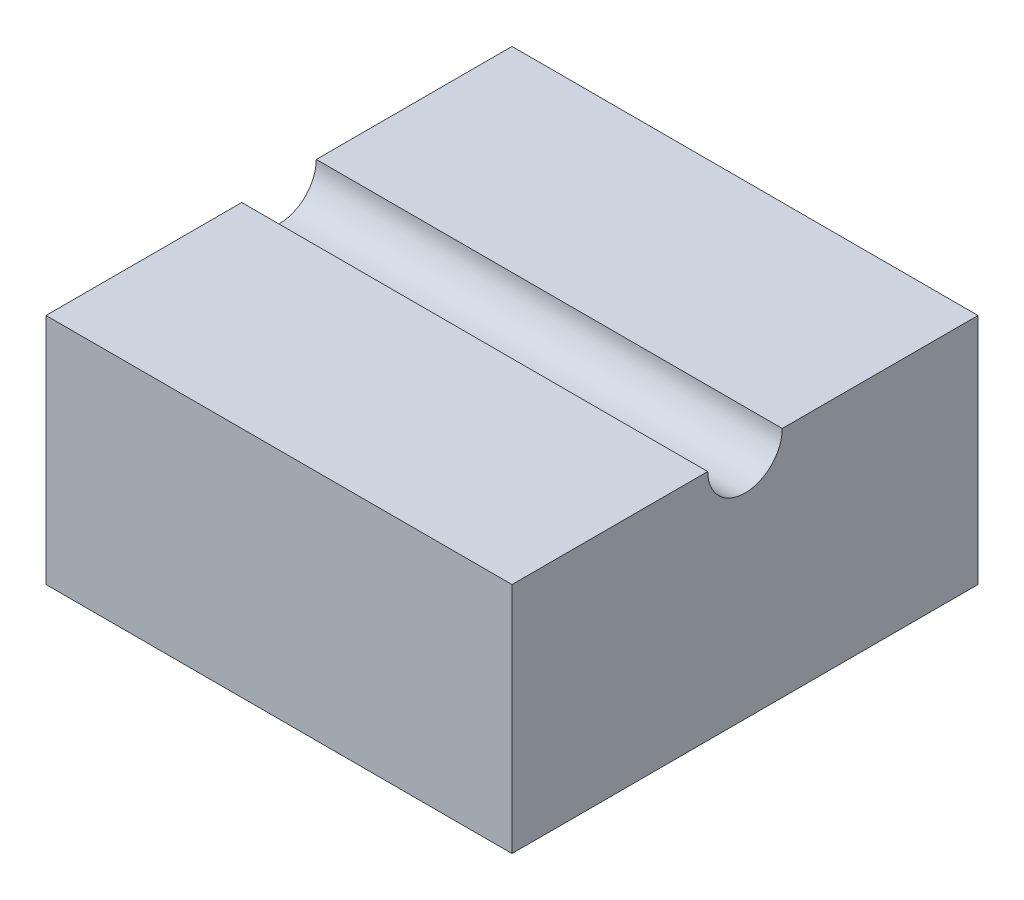
ISO-10303-21;
HEADER;
FILE_DESCRIPTION(('STEP AP214'),'2;1');
FILE_NAME('part.step','',(''),(''),'','','');
FILE_SCHEMA(('AUTOMOTIVE_DESIGN { 1 0 10303 214 1 1 1 1 }'));
ENDSEC;
DATA;
#1=APPLICATION_CONTEXT('core data for automotive mechanical design processes');
#2=APPLICATION_PROTOCOL_DEFINITION('international standard','automotive_design',2000,#1);
#3=PRODUCT_CONTEXT('',#1,'mechanical');
#4=PRODUCT('Part','Part','',(#3));
#5=PRODUCT_RELATED_PRODUCT_CATEGORY('part','',(#4));
#6=PRODUCT_DEFINITION_FORMATION('','',#4);
#7=PRODUCT_DEFINITION_CONTEXT('part definition',#1,'design');
#8=PRODUCT_DEFINITION('design','',#6,#7);
#9=PRODUCT_DEFINITION_SHAPE('','',#8);
#10=(LENGTH_UNIT() NAMED_UNIT(*) SI_UNIT(.MILLI.,.METRE.));
#11=(NAMED_UNIT(*) PLANE_ANGLE_UNIT() SI_UNIT($,.RADIAN.));
#12=(NAMED_UNIT(*) SI_UNIT($,.STERADIAN.) SOLID_ANGLE_UNIT());
#13=UNCERTAINTY_MEASURE_WITH_UNIT(LENGTH_MEASURE(1.E-05),#10,'distance_accuracy_value','');
#14=(GEOMETRIC_REPRESENTATION_CONTEXT(3) GLOBAL_UNCERTAINTY_ASSIGNED_CONTEXT((#13)) GLOBAL_UNIT_ASSIGNED_CONTEXT((#10,
#11,#12)) REPRESENTATION_CONTEXT('',''));
#15=CARTESIAN_POINT('',(0.,0.,0.));
#16=DIRECTION('',(0.,0.,1.));
#17=DIRECTION('',(1.,0.,0.));
#18=AXIS2_PLACEMENT_3D('',#15,#16,#17);
#19=CARTESIAN_POINT('',(0.,50.,0.));
#20=DIRECTION('',(0.,1.,0.));
#21=DIRECTION('',(0.,0.,1.));
#22=AXIS2_PLACEMENT_3D('',#19,#20,#21);
#23=PLANE('',#22);
#24=DIRECTION('',(1.,0.,0.));
#25=VECTOR('',#24,1.);
#26=CARTESIAN_POINT('',(0.,50.,58.));
#27=LINE('',#26,#25);
#28=CARTESIAN_POINT('',(0.,50.,58.));
#29=VERTEX_POINT('',#28);
#30=CARTESIAN_POINT('',(100.,50.,58.));
#31=VERTEX_POINT('',#30);
#32=EDGE_CURVE('E11',#29,#31,#27,.T.);
#33=ORIENTED_EDGE('',*,*,#32,.F.);
#34=DIRECTION('',(0.,0.,1.));
#35=VECTOR('',#34,1.);
#36=CARTESIAN_POINT('',(0.,50.,0.));
#37=LINE('',#36,#35);
#38=CARTESIAN_POINT('',(0.,50.,100.));
#39=VERTEX_POINT('',#38);
#40=EDGE_CURVE('E100',#29,#39,#37,.T.);
#41=ORIENTED_EDGE('',*,*,#40,.T.);
#42=DIRECTION('',(1.,0.,0.));
#43=VECTOR('',#42,1.);
#44=CARTESIAN_POINT('',(0.,50.,100.));
#45=LINE('',#44,#43);
#46=CARTESIAN_POINT('',(100.,50.,100.));
#47=VERTEX_POINT('',#46);
#48=EDGE_CURVE('E122',#39,#47,#45,.T.);
#49=ORIENTED_EDGE('',*,*,#48,.T.);
#50=DIRECTION('',(0.,0.,-1.));
#51=VECTOR('',#50,1.);
#52=CARTESIAN_POINT('',(100.,50.,0.));
#53=LINE('',#52,#51);
#54=EDGE_CURVE('E117',#47,#31,#53,.T.);
#55=ORIENTED_EDGE('',*,*,#54,.T.);
#56=EDGE_LOOP('',(#33,#41,#49,#55));
#57=FACE_BOUND('',#56,.T.);
#58=ADVANCED_FACE('F47',(#57),#23,.T.);
#59=CARTESIAN_POINT('',(0.,50.,0.));
#60=DIRECTION('',(1.,0.,0.));
#61=DIRECTION('',(0.,0.,-1.));
#62=AXIS2_PLACEMENT_3D('',#59,#60,#61);
#63=PLANE('',#62);
#64=ORIENTED_EDGE('',*,*,#40,.F.);
#65=CARTESIAN_POINT('',(0.,50.,50.));
#66=DIRECTION('',(1.,0.,0.));
#67=DIRECTION('',(0.,0.,-1.));
#68=AXIS2_PLACEMENT_3D('',#65,#66,#67);
#69=CIRCLE('',#68,8.);
#70=CARTESIAN_POINT('',(0.,50.,42.));
#71=VERTEX_POINT('',#70);
#72=EDGE_CURVE('E110',#29,#71,#69,.T.);
#73=ORIENTED_EDGE('',*,*,#72,.T.);
#74=CARTESIAN_POINT('',(0.,50.,0.));
#75=VERTEX_POINT('',#74);
#76=EDGE_CURVE('E159',#75,#71,#37,.T.);
#77=ORIENTED_EDGE('',*,*,#76,.F.);
#78=DIRECTION('',(0.,-1.,0.));
#79=VECTOR('',#78,1.);
#80=CARTESIAN_POINT('',(0.,50.,0.));
#81=LINE('',#80,#79);
#82=CARTESIAN_POINT('',(0.,0.,0.));
#83=VERTEX_POINT('',#82);
#84=EDGE_CURVE('E128',#75,#83,#81,.T.);
#85=ORIENTED_EDGE('',*,*,#84,.T.);
#86=DIRECTION('',(0.,0.,1.));
#87=VECTOR('',#86,1.);
#88=CARTESIAN_POINT('',(0.,0.,0.));
#89=LINE('',#88,#87);
#90=CARTESIAN_POINT('',(0.,0.,100.));
#91=VERTEX_POINT('',#90);
#92=EDGE_CURVE('E133',#83,#91,#89,.T.);
#93=ORIENTED_EDGE('',*,*,#92,.T.);
#94=DIRECTION('',(0.,-1.,0.));
#95=VECTOR('',#94,1.);
#96=CARTESIAN_POINT('',(0.,50.,100.));
#97=LINE('',#96,#95);
#98=EDGE_CURVE('E153',#39,#91,#97,.T.);
#99=ORIENTED_EDGE('',*,*,#98,.F.);
#100=EDGE_LOOP('',(#64,#73,#77,#85,#93,#99));
#101=FACE_BOUND('',#100,.T.);
#102=ADVANCED_FACE('F49',(#101),#63,.F.);
#103=CARTESIAN_POINT('',(0.,50.,100.));
#104=DIRECTION('',(0.,0.,-1.));
#105=DIRECTION('',(-1.,0.,0.));
#106=AXIS2_PLACEMENT_3D('',#103,#104,#105);
#107=PLANE('',#106);
#108=DIRECTION('',(1.,0.,0.));
#109=VECTOR('',#108,1.);
#110=CARTESIAN_POINT('',(0.,0.,100.));
#111=LINE('',#110,#109);
#112=CARTESIAN_POINT('',(100.,0.,100.));
#113=VERTEX_POINT('',#112);
#114=EDGE_CURVE('E137',#91,#113,#111,.T.);
#115=ORIENTED_EDGE('',*,*,#114,.T.);
#116=DIRECTION('',(0.,-1.,0.));
#117=VECTOR('',#116,1.);
#118=CARTESIAN_POINT('',(100.,50.,100.));
#119=LINE('',#118,#117);
#120=EDGE_CURVE('E150',#47,#113,#119,.T.);
#121=ORIENTED_EDGE('',*,*,#120,.F.);
#122=ORIENTED_EDGE('',*,*,#48,.F.);
#123=ORIENTED_EDGE('',*,*,#98,.T.);
#124=EDGE_LOOP('',(#115,#121,#122,#123));
#125=FACE_BOUND('',#124,.T.);
#126=ADVANCED_FACE('F185',(#125),#107,.F.);
#127=CARTESIAN_POINT('',(100.,50.,0.));
#128=DIRECTION('',(-1.,0.,0.));
#129=DIRECTION('',(0.,0.,1.));
#130=AXIS2_PLACEMENT_3D('',#127,#128,#129);
#131=PLANE('',#130);
#132=CARTESIAN_POINT('',(100.,50.,42.));
#133=VERTEX_POINT('',#132);
#134=CARTESIAN_POINT('',(100.,50.,0.));
#135=VERTEX_POINT('',#134);
#136=EDGE_CURVE('E119',#133,#135,#53,.T.);
#137=ORIENTED_EDGE('',*,*,#136,.F.);
#138=CARTESIAN_POINT('',(100.,50.,50.));
#139=DIRECTION('',(1.,0.,0.));
#140=DIRECTION('',(0.,0.,-1.));
#141=AXIS2_PLACEMENT_3D('',#138,#139,#140);
#142=CIRCLE('',#141,8.);
#143=EDGE_CURVE('E62',#31,#133,#142,.T.);
#144=ORIENTED_EDGE('',*,*,#143,.F.);
#145=ORIENTED_EDGE('',*,*,#54,.F.);
#146=ORIENTED_EDGE('',*,*,#120,.T.);
#147=DIRECTION('',(0.,0.,-1.));
#148=VECTOR('',#147,1.);
#149=CARTESIAN_POINT('',(100.,0.,0.));
#150=LINE('',#149,#148);
#151=CARTESIAN_POINT('',(100.,0.,0.));
#152=VERTEX_POINT('',#151);
#153=EDGE_CURVE('E140',#113,#152,#150,.T.);
#154=ORIENTED_EDGE('',*,*,#153,.T.);
#155=DIRECTION('',(0.,-1.,0.));
#156=VECTOR('',#155,1.);
#157=CARTESIAN_POINT('',(100.,50.,0.));
#158=LINE('',#157,#156);
#159=EDGE_CURVE('E147',#135,#152,#158,.T.);
#160=ORIENTED_EDGE('',*,*,#159,.F.);
#161=EDGE_LOOP('',(#137,#144,#145,#146,#154,#160));
#162=FACE_BOUND('',#161,.T.);
#163=ADVANCED_FACE('F115',(#162),#131,.F.);
#164=CARTESIAN_POINT('',(0.,50.,0.));
#165=DIRECTION('',(0.,0.,1.));
#166=DIRECTION('',(1.,0.,0.));
#167=AXIS2_PLACEMENT_3D('',#164,#165,#166);
#168=PLANE('',#167);
#169=DIRECTION('',(-1.,0.,0.));
#170=VECTOR('',#169,1.);
#171=CARTESIAN_POINT('',(0.,0.,0.));
#172=LINE('',#171,#170);
#173=EDGE_CURVE('E92',#152,#83,#172,.T.);
#174=ORIENTED_EDGE('',*,*,#173,.T.);
#175=ORIENTED_EDGE('',*,*,#84,.F.);
#176=DIRECTION('',(-1.,0.,0.));
#177=VECTOR('',#176,1.);
#178=CARTESIAN_POINT('',(0.,50.,0.));
#179=LINE('',#178,#177);
#180=EDGE_CURVE('E71',#135,#75,#179,.T.);
#181=ORIENTED_EDGE('',*,*,#180,.F.);
#182=ORIENTED_EDGE('',*,*,#159,.T.);
#183=EDGE_LOOP('',(#174,#175,#181,#182));
#184=FACE_BOUND('',#183,.T.);
#185=ADVANCED_FACE('F169',(#184),#168,.F.);
#186=DIRECTION('',(1.,0.,0.));
#187=VECTOR('',#186,1.);
#188=CARTESIAN_POINT('',(0.,50.,42.));
#189=LINE('',#188,#187);
#190=EDGE_CURVE('E56',#133,#71,#189,.F.);
#191=ORIENTED_EDGE('',*,*,#190,.F.);
#192=ORIENTED_EDGE('',*,*,#136,.T.);
#193=ORIENTED_EDGE('',*,*,#180,.T.);
#194=ORIENTED_EDGE('',*,*,#76,.T.);
#195=EDGE_LOOP('',(#191,#192,#193,#194));
#196=FACE_BOUND('',#195,.T.);
#197=ADVANCED_FACE('F163',(#196),#23,.T.);
#198=CARTESIAN_POINT('',(0.,0.,0.));
#199=DIRECTION('',(0.,1.,0.));
#200=DIRECTION('',(0.,0.,1.));
#201=AXIS2_PLACEMENT_3D('',#198,#199,#200);
#202=PLANE('',#201);
#203=ORIENTED_EDGE('',*,*,#92,.F.);
#204=ORIENTED_EDGE('',*,*,#173,.F.);
#205=ORIENTED_EDGE('',*,*,#153,.F.);
#206=ORIENTED_EDGE('',*,*,#114,.F.);
#207=EDGE_LOOP('',(#203,#204,#205,#206));
#208=FACE_BOUND('',#207,.T.);
#209=ADVANCED_FACE('F168',(#208),#202,.F.);
#210=CARTESIAN_POINT('',(0.,50.,50.));
#211=DIRECTION('',(1.,0.,0.));
#212=DIRECTION('',(0.,0.,-1.));
#213=AXIS2_PLACEMENT_3D('',#210,#211,#212);
#214=CYLINDRICAL_SURFACE('',#213,8.);
#215=ORIENTED_EDGE('',*,*,#32,.T.);
#216=ORIENTED_EDGE('',*,*,#143,.T.);
#217=ORIENTED_EDGE('',*,*,#190,.T.);
#218=ORIENTED_EDGE('',*,*,#72,.F.);
#219=EDGE_LOOP('',(#215,#216,#217,#218));
#220=FACE_BOUND('',#219,.T.);
#221=ADVANCED_FACE('F108',(#220),#214,.F.);
#222=CLOSED_SHELL('',(#58,#102,#126,#163,#185,#197,#209,#221));
#223=MANIFOLD_SOLID_BREP('B2',#222);
#224=ADVANCED_BREP_SHAPE_REPRESENTATION('',(#18,#223),#14);
#225=SHAPE_DEFINITION_REPRESENTATION(#9,#224);
ENDSEC;
END-ISO-10303-21;
